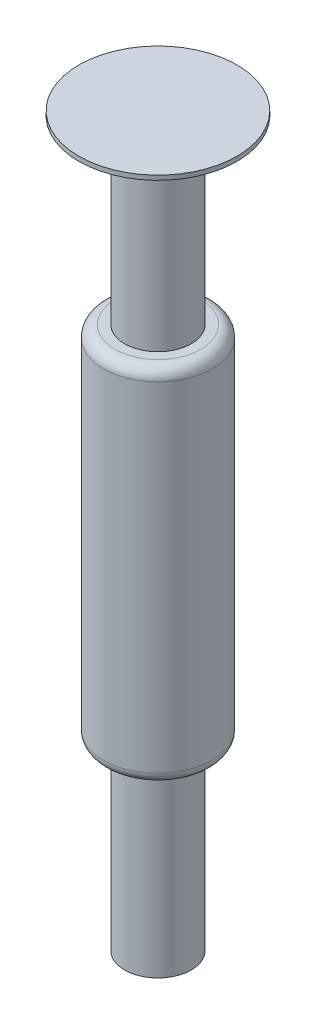
ISO-10303-21;
HEADER;
FILE_DESCRIPTION(('STEP AP214'),'2;1');
FILE_NAME('part.step','',(''),(''),'','','');
FILE_SCHEMA(('AUTOMOTIVE_DESIGN { 1 0 10303 214 1 1 1 1 }'));
ENDSEC;
DATA;
#1=APPLICATION_CONTEXT('core data for automotive mechanical design processes');
#2=APPLICATION_PROTOCOL_DEFINITION('international standard','automotive_design',2000,#1);
#3=PRODUCT_CONTEXT('',#1,'mechanical');
#4=PRODUCT('Part','Part','',(#3));
#5=PRODUCT_RELATED_PRODUCT_CATEGORY('part','',(#4));
#6=PRODUCT_DEFINITION_FORMATION('','',#4);
#7=PRODUCT_DEFINITION_CONTEXT('part definition',#1,'design');
#8=PRODUCT_DEFINITION('design','',#6,#7);
#9=PRODUCT_DEFINITION_SHAPE('','',#8);
#10=(LENGTH_UNIT() NAMED_UNIT(*) SI_UNIT(.MILLI.,.METRE.));
#11=(NAMED_UNIT(*) PLANE_ANGLE_UNIT() SI_UNIT($,.RADIAN.));
#12=(NAMED_UNIT(*) SI_UNIT($,.STERADIAN.) SOLID_ANGLE_UNIT());
#13=UNCERTAINTY_MEASURE_WITH_UNIT(LENGTH_MEASURE(1.E-05),#10,'distance_accuracy_value','');
#14=(GEOMETRIC_REPRESENTATION_CONTEXT(3) GLOBAL_UNCERTAINTY_ASSIGNED_CONTEXT((#13)) GLOBAL_UNIT_ASSIGNED_CONTEXT((#10,
#11,#12)) REPRESENTATION_CONTEXT('',''));
#15=CARTESIAN_POINT('',(0.,0.,0.));
#16=DIRECTION('',(0.,0.,1.));
#17=DIRECTION('',(1.,0.,0.));
#18=AXIS2_PLACEMENT_3D('',#15,#16,#17);
#19=CARTESIAN_POINT('',(0.,32.,0.));
#20=DIRECTION('',(0.,-1.,0.));
#21=DIRECTION('',(0.,0.,-1.));
#22=AXIS2_PLACEMENT_3D('',#19,#20,#21);
#23=CYLINDRICAL_SURFACE('',#22,4.8);
#24=CARTESIAN_POINT('',(0.,1.,0.));
#25=DIRECTION('',(0.,1.,0.));
#26=DIRECTION('',(0.,0.,1.));
#27=AXIS2_PLACEMENT_3D('',#24,#25,#26);
#28=CIRCLE('',#27,4.8);
#29=CARTESIAN_POINT('',(0.,1.,4.8));
#30=VERTEX_POINT('',#29);
#31=EDGE_CURVE('E50',#30,#30,#28,.T.);
#32=ORIENTED_EDGE('',*,*,#31,.T.);
#33=EDGE_LOOP('',(#32));
#34=FACE_BOUND('',#33,.T.);
#35=CARTESIAN_POINT('',(0.,31.,0.));
#36=DIRECTION('',(0.,1.,0.));
#37=DIRECTION('',(0.,0.,1.));
#38=AXIS2_PLACEMENT_3D('',#35,#36,#37);
#39=CIRCLE('',#38,4.8);
#40=CARTESIAN_POINT('',(0.,31.,4.8));
#41=VERTEX_POINT('',#40);
#42=EDGE_CURVE('E55',#41,#41,#39,.F.);
#43=ORIENTED_EDGE('',*,*,#42,.T.);
#44=EDGE_LOOP('',(#43));
#45=FACE_BOUND('',#44,.T.);
#46=ADVANCED_FACE('F37',(#34,#45),#23,.T.);
#47=CARTESIAN_POINT('',(0.,32.,0.));
#48=DIRECTION('',(0.,1.,0.));
#49=DIRECTION('',(0.,0.,1.));
#50=AXIS2_PLACEMENT_3D('',#47,#48,#49);
#51=PLANE('',#50);
#52=CARTESIAN_POINT('',(0.,32.,0.));
#53=DIRECTION('',(0.,1.,0.));
#54=DIRECTION('',(0.,0.,1.));
#55=AXIS2_PLACEMENT_3D('',#52,#53,#54);
#56=CIRCLE('',#55,3.8);
#57=CARTESIAN_POINT('',(0.,32.,3.8));
#58=VERTEX_POINT('',#57);
#59=EDGE_CURVE('E10',#58,#58,#56,.T.);
#60=ORIENTED_EDGE('',*,*,#59,.T.);
#61=EDGE_LOOP('',(#60));
#62=FACE_BOUND('',#61,.T.);
#63=CARTESIAN_POINT('',(0.,32.,0.));
#64=DIRECTION('',(0.,1.,0.));
#65=DIRECTION('',(0.,0.,1.));
#66=AXIS2_PLACEMENT_3D('',#63,#64,#65);
#67=CIRCLE('',#66,2.95);
#68=CARTESIAN_POINT('',(0.,32.,2.95));
#69=VERTEX_POINT('',#68);
#70=EDGE_CURVE('E62',#69,#69,#67,.T.);
#71=ORIENTED_EDGE('',*,*,#70,.F.);
#72=EDGE_LOOP('',(#71));
#73=FACE_BOUND('',#72,.T.);
#74=ADVANCED_FACE('F103',(#62,#73),#51,.T.);
#75=CARTESIAN_POINT('',(0.,0.,0.));
#76=DIRECTION('',(0.,1.,0.));
#77=DIRECTION('',(0.,0.,1.));
#78=AXIS2_PLACEMENT_3D('',#75,#76,#77);
#79=PLANE('',#78);
#80=CARTESIAN_POINT('',(0.,0.,0.));
#81=DIRECTION('',(0.,1.,0.));
#82=DIRECTION('',(0.,0.,1.));
#83=AXIS2_PLACEMENT_3D('',#80,#81,#82);
#84=CIRCLE('',#83,3.8);
#85=CARTESIAN_POINT('',(0.,0.,3.8));
#86=VERTEX_POINT('',#85);
#87=EDGE_CURVE('E45',#86,#86,#84,.F.);
#88=ORIENTED_EDGE('',*,*,#87,.T.);
#89=EDGE_LOOP('',(#88));
#90=FACE_BOUND('',#89,.T.);
#91=CARTESIAN_POINT('',(0.,0.,0.));
#92=DIRECTION('',(0.,-1.,0.));
#93=DIRECTION('',(0.,0.,-1.));
#94=AXIS2_PLACEMENT_3D('',#91,#92,#93);
#95=CIRCLE('',#94,2.95);
#96=CARTESIAN_POINT('',(0.,0.,-2.95));
#97=VERTEX_POINT('',#96);
#98=EDGE_CURVE('E61',#97,#97,#95,.T.);
#99=ORIENTED_EDGE('',*,*,#98,.F.);
#100=EDGE_LOOP('',(#99));
#101=FACE_BOUND('',#100,.T.);
#102=ADVANCED_FACE('F109',(#90,#101),#79,.F.);
#103=CARTESIAN_POINT('',(0.,48.,0.));
#104=DIRECTION('',(0.,-1.,0.));
#105=DIRECTION('',(0.,0.,-1.));
#106=AXIS2_PLACEMENT_3D('',#103,#104,#105);
#107=CYLINDRICAL_SURFACE('',#106,2.95);
#108=CARTESIAN_POINT('',(0.,48.,0.));
#109=DIRECTION('',(0.,1.,0.));
#110=DIRECTION('',(0.,0.,1.));
#111=AXIS2_PLACEMENT_3D('',#108,#109,#110);
#112=CIRCLE('',#111,2.95);
#113=CARTESIAN_POINT('',(0.,48.,2.95));
#114=VERTEX_POINT('',#113);
#115=EDGE_CURVE('E66',#114,#114,#112,.T.);
#116=ORIENTED_EDGE('',*,*,#115,.F.);
#117=EDGE_LOOP('',(#116));
#118=FACE_BOUND('',#117,.T.);
#119=ORIENTED_EDGE('',*,*,#70,.T.);
#120=EDGE_LOOP('',(#119));
#121=FACE_BOUND('',#120,.T.);
#122=ADVANCED_FACE('F130',(#118,#121),#107,.T.);
#123=CARTESIAN_POINT('',(0.,-16.,0.));
#124=DIRECTION('',(0.,1.,0.));
#125=DIRECTION('',(0.,0.,1.));
#126=AXIS2_PLACEMENT_3D('',#123,#124,#125);
#127=CYLINDRICAL_SURFACE('',#126,2.95);
#128=CARTESIAN_POINT('',(0.,-16.,0.));
#129=DIRECTION('',(0.,-1.,0.));
#130=DIRECTION('',(0.,0.,-1.));
#131=AXIS2_PLACEMENT_3D('',#128,#129,#130);
#132=CIRCLE('',#131,2.95);
#133=CARTESIAN_POINT('',(0.,-16.,-2.95));
#134=VERTEX_POINT('',#133);
#135=EDGE_CURVE('E70',#134,#134,#132,.T.);
#136=ORIENTED_EDGE('',*,*,#135,.F.);
#137=EDGE_LOOP('',(#136));
#138=FACE_BOUND('',#137,.T.);
#139=ORIENTED_EDGE('',*,*,#98,.T.);
#140=EDGE_LOOP('',(#139));
#141=FACE_BOUND('',#140,.T.);
#142=ADVANCED_FACE('F122',(#138,#141),#127,.T.);
#143=CARTESIAN_POINT('',(0.,-16.,0.));
#144=DIRECTION('',(0.,-1.,0.));
#145=DIRECTION('',(0.,0.,-1.));
#146=AXIS2_PLACEMENT_3D('',#143,#144,#145);
#147=PLANE('',#146);
#148=ORIENTED_EDGE('',*,*,#135,.T.);
#149=EDGE_LOOP('',(#148));
#150=FACE_BOUND('',#149,.T.);
#151=ADVANCED_FACE('F115',(#150),#147,.T.);
#152=CARTESIAN_POINT('',(0.,1.,0.));
#153=DIRECTION('',(0.,1.,0.));
#154=DIRECTION('',(0.,0.,1.));
#155=AXIS2_PLACEMENT_3D('',#152,#153,#154);
#156=TOROIDAL_SURFACE('',#155,3.8,1.);
#157=ORIENTED_EDGE('',*,*,#87,.F.);
#158=EDGE_LOOP('',(#157));
#159=FACE_BOUND('',#158,.T.);
#160=ORIENTED_EDGE('',*,*,#31,.F.);
#161=EDGE_LOOP('',(#160));
#162=FACE_BOUND('',#161,.T.);
#163=ADVANCED_FACE('F113',(#159,#162),#156,.T.);
#164=CARTESIAN_POINT('',(0.,31.,0.));
#165=DIRECTION('',(0.,1.,0.));
#166=DIRECTION('',(0.,0.,1.));
#167=AXIS2_PLACEMENT_3D('',#164,#165,#166);
#168=TOROIDAL_SURFACE('',#167,3.8,1.);
#169=ORIENTED_EDGE('',*,*,#42,.F.);
#170=EDGE_LOOP('',(#169));
#171=FACE_BOUND('',#170,.T.);
#172=ORIENTED_EDGE('',*,*,#59,.F.);
#173=EDGE_LOOP('',(#172));
#174=FACE_BOUND('',#173,.T.);
#175=ADVANCED_FACE('F39',(#171,#174),#168,.T.);
#176=CARTESIAN_POINT('',(0.,48.4,0.));
#177=DIRECTION('',(0.,-1.,0.));
#178=DIRECTION('',(0.,0.,-1.));
#179=AXIS2_PLACEMENT_3D('',#176,#177,#178);
#180=CYLINDRICAL_SURFACE('',#179,7.);
#181=CARTESIAN_POINT('',(0.,48.4,0.));
#182=DIRECTION('',(0.,1.,0.));
#183=DIRECTION('',(0.,0.,1.));
#184=AXIS2_PLACEMENT_3D('',#181,#182,#183);
#185=CIRCLE('',#184,7.);
#186=CARTESIAN_POINT('',(0.,48.4,7.));
#187=VERTEX_POINT('',#186);
#188=EDGE_CURVE('E77',#187,#187,#185,.T.);
#189=ORIENTED_EDGE('',*,*,#188,.F.);
#190=EDGE_LOOP('',(#189));
#191=FACE_BOUND('',#190,.T.);
#192=CARTESIAN_POINT('',(0.,48.,0.));
#193=DIRECTION('',(0.,1.,0.));
#194=DIRECTION('',(0.,0.,1.));
#195=AXIS2_PLACEMENT_3D('',#192,#193,#194);
#196=CIRCLE('',#195,7.);
#197=CARTESIAN_POINT('',(0.,48.,7.));
#198=VERTEX_POINT('',#197);
#199=EDGE_CURVE('E78',#198,#198,#196,.T.);
#200=ORIENTED_EDGE('',*,*,#199,.T.);
#201=EDGE_LOOP('',(#200));
#202=FACE_BOUND('',#201,.T.);
#203=ADVANCED_FACE('F88',(#191,#202),#180,.T.);
#204=CARTESIAN_POINT('',(0.,48.4,0.));
#205=DIRECTION('',(0.,1.,0.));
#206=DIRECTION('',(0.,0.,1.));
#207=AXIS2_PLACEMENT_3D('',#204,#205,#206);
#208=PLANE('',#207);
#209=ORIENTED_EDGE('',*,*,#188,.T.);
#210=EDGE_LOOP('',(#209));
#211=FACE_BOUND('',#210,.T.);
#212=ADVANCED_FACE('F86',(#211),#208,.T.);
#213=CARTESIAN_POINT('',(0.,48.,0.));
#214=DIRECTION('',(0.,1.,0.));
#215=DIRECTION('',(0.,0.,1.));
#216=AXIS2_PLACEMENT_3D('',#213,#214,#215);
#217=PLANE('',#216);
#218=ORIENTED_EDGE('',*,*,#115,.T.);
#219=EDGE_LOOP('',(#218));
#220=FACE_BOUND('',#219,.T.);
#221=ORIENTED_EDGE('',*,*,#199,.F.);
#222=EDGE_LOOP('',(#221));
#223=FACE_BOUND('',#222,.T.);
#224=ADVANCED_FACE('F94',(#220,#223),#217,.F.);
#225=CLOSED_SHELL('',(#46,#74,#102,#122,#142,#151,#163,#175,#203,#212,#224));
#226=MANIFOLD_SOLID_BREP('B2',#225);
#227=ADVANCED_BREP_SHAPE_REPRESENTATION('',(#18,#226),#14);
#228=SHAPE_DEFINITION_REPRESENTATION(#9,#227);
ENDSEC;
END-ISO-10303-21;
